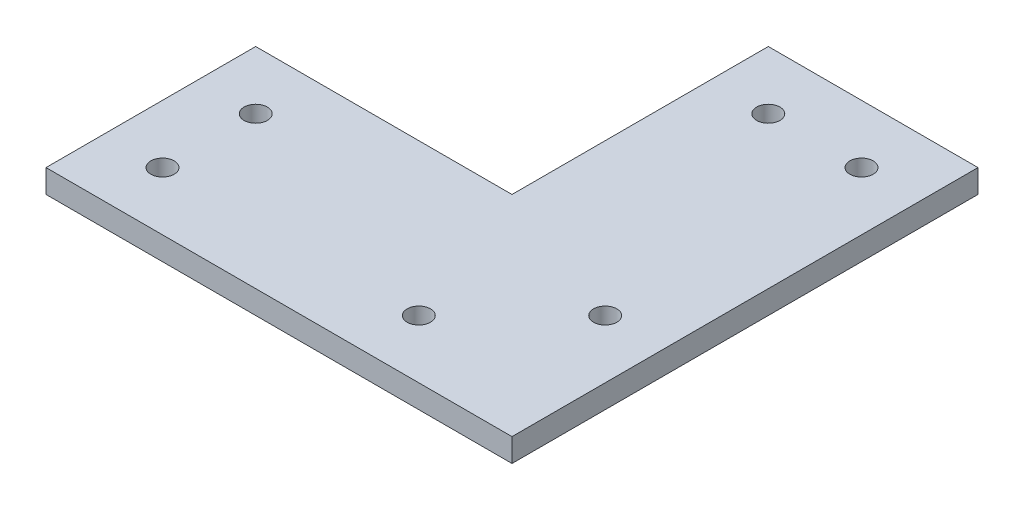
ISO-10303-21;
HEADER;
FILE_DESCRIPTION(('STEP AP214'),'2;1');
FILE_NAME('part.step','',(''),(''),'','','');
FILE_SCHEMA(('AUTOMOTIVE_DESIGN { 1 0 10303 214 1 1 1 1 }'));
ENDSEC;
DATA;
#1=APPLICATION_CONTEXT('core data for automotive mechanical design processes');
#2=APPLICATION_PROTOCOL_DEFINITION('international standard','automotive_design',2000,#1);
#3=PRODUCT_CONTEXT('',#1,'mechanical');
#4=PRODUCT('Part','Part','',(#3));
#5=PRODUCT_RELATED_PRODUCT_CATEGORY('part','',(#4));
#6=PRODUCT_DEFINITION_FORMATION('','',#4);
#7=PRODUCT_DEFINITION_CONTEXT('part definition',#1,'design');
#8=PRODUCT_DEFINITION('design','',#6,#7);
#9=PRODUCT_DEFINITION_SHAPE('','',#8);
#10=(LENGTH_UNIT() NAMED_UNIT(*) SI_UNIT(.MILLI.,.METRE.));
#11=(NAMED_UNIT(*) PLANE_ANGLE_UNIT() SI_UNIT($,.RADIAN.));
#12=(NAMED_UNIT(*) SI_UNIT($,.STERADIAN.) SOLID_ANGLE_UNIT());
#13=UNCERTAINTY_MEASURE_WITH_UNIT(LENGTH_MEASURE(1.E-05),#10,'distance_accuracy_value','');
#14=(GEOMETRIC_REPRESENTATION_CONTEXT(3) GLOBAL_UNCERTAINTY_ASSIGNED_CONTEXT((#13)) GLOBAL_UNIT_ASSIGNED_CONTEXT((#10,
#11,#12)) REPRESENTATION_CONTEXT('',''));
#15=CARTESIAN_POINT('',(0.,0.,0.));
#16=DIRECTION('',(0.,0.,1.));
#17=DIRECTION('',(1.,0.,0.));
#18=AXIS2_PLACEMENT_3D('',#15,#16,#17);
#19=CARTESIAN_POINT('',(0.,3.175,0.));
#20=DIRECTION('',(0.,1.,0.));
#21=DIRECTION('',(0.,0.,1.));
#22=AXIS2_PLACEMENT_3D('',#19,#20,#21);
#23=PLANE('',#22);
#24=CARTESIAN_POINT('',(55.5625,3.175,-55.5625));
#25=DIRECTION('',(0.,1.,0.));
#26=DIRECTION('',(0.,0.,1.));
#27=AXIS2_PLACEMENT_3D('',#24,#25,#26);
#28=CIRCLE('',#27,1.5875);
#29=CARTESIAN_POINT('',(55.5625,3.175,-53.975));
#30=VERTEX_POINT('',#29);
#31=EDGE_CURVE('E200',#30,#30,#28,.T.);
#32=ORIENTED_EDGE('',*,*,#31,.F.);
#33=EDGE_LOOP('',(#32));
#34=FACE_BOUND('',#33,.T.);
#35=CARTESIAN_POINT('',(42.8625,3.175,-7.93750000000001));
#36=DIRECTION('',(0.,1.,0.));
#37=DIRECTION('',(0.,0.,1.));
#38=AXIS2_PLACEMENT_3D('',#35,#36,#37);
#39=CIRCLE('',#38,1.5875);
#40=CARTESIAN_POINT('',(42.8625,3.175,-6.35000000000002));
#41=VERTEX_POINT('',#40);
#42=EDGE_CURVE('E212',#41,#41,#39,.T.);
#43=ORIENTED_EDGE('',*,*,#42,.F.);
#44=EDGE_LOOP('',(#43));
#45=FACE_BOUND('',#44,.T.);
#46=CARTESIAN_POINT('',(7.93749999999999,3.175,-20.6375));
#47=DIRECTION('',(0.,1.,0.));
#48=DIRECTION('',(0.,0.,1.));
#49=AXIS2_PLACEMENT_3D('',#46,#47,#48);
#50=CIRCLE('',#49,1.5875);
#51=CARTESIAN_POINT('',(7.93749999999999,3.175,-19.05));
#52=VERTEX_POINT('',#51);
#53=EDGE_CURVE('E125',#52,#52,#50,.T.);
#54=ORIENTED_EDGE('',*,*,#53,.F.);
#55=EDGE_LOOP('',(#54));
#56=FACE_BOUND('',#55,.T.);
#57=DIRECTION('',(1.,0.,0.));
#58=VECTOR('',#57,1.);
#59=CARTESIAN_POINT('',(0.,3.175,0.));
#60=LINE('',#59,#58);
#61=CARTESIAN_POINT('',(0.,3.175,0.));
#62=VERTEX_POINT('',#61);
#63=CARTESIAN_POINT('',(63.5,3.175,0.));
#64=VERTEX_POINT('',#63);
#65=EDGE_CURVE('E132',#62,#64,#60,.T.);
#66=ORIENTED_EDGE('',*,*,#65,.T.);
#67=DIRECTION('',(0.,0.,-1.));
#68=VECTOR('',#67,1.);
#69=CARTESIAN_POINT('',(63.5,3.175,0.));
#70=LINE('',#69,#68);
#71=CARTESIAN_POINT('',(63.5,3.175,-63.5));
#72=VERTEX_POINT('',#71);
#73=EDGE_CURVE('E90',#64,#72,#70,.T.);
#74=ORIENTED_EDGE('',*,*,#73,.T.);
#75=DIRECTION('',(-1.,0.,0.));
#76=VECTOR('',#75,1.);
#77=CARTESIAN_POINT('',(34.925,3.175,-63.5));
#78=LINE('',#77,#76);
#79=CARTESIAN_POINT('',(34.925,3.175,-63.5));
#80=VERTEX_POINT('',#79);
#81=EDGE_CURVE('E103',#72,#80,#78,.T.);
#82=ORIENTED_EDGE('',*,*,#81,.T.);
#83=DIRECTION('',(0.,0.,1.));
#84=VECTOR('',#83,1.);
#85=CARTESIAN_POINT('',(34.925,3.175,-28.575));
#86=LINE('',#85,#84);
#87=CARTESIAN_POINT('',(34.925,3.175,-28.575));
#88=VERTEX_POINT('',#87);
#89=EDGE_CURVE('E97',#80,#88,#86,.T.);
#90=ORIENTED_EDGE('',*,*,#89,.T.);
#91=DIRECTION('',(-1.,0.,0.));
#92=VECTOR('',#91,1.);
#93=CARTESIAN_POINT('',(0.,3.175,-28.575));
#94=LINE('',#93,#92);
#95=CARTESIAN_POINT('',(0.,3.175,-28.575));
#96=VERTEX_POINT('',#95);
#97=EDGE_CURVE('E101',#88,#96,#94,.T.);
#98=ORIENTED_EDGE('',*,*,#97,.T.);
#99=DIRECTION('',(0.,0.,1.));
#100=VECTOR('',#99,1.);
#101=CARTESIAN_POINT('',(0.,3.175,0.));
#102=LINE('',#101,#100);
#103=EDGE_CURVE('E53',#96,#62,#102,.T.);
#104=ORIENTED_EDGE('',*,*,#103,.T.);
#105=EDGE_LOOP('',(#66,#74,#82,#90,#98,#104));
#106=FACE_BOUND('',#105,.T.);
#107=CARTESIAN_POINT('',(7.93749999999999,3.175,-7.93750000000001));
#108=DIRECTION('',(0.,1.,0.));
#109=DIRECTION('',(0.,0.,1.));
#110=AXIS2_PLACEMENT_3D('',#107,#108,#109);
#111=CIRCLE('',#110,1.5875);
#112=CARTESIAN_POINT('',(7.93749999999999,3.175,-6.35000000000001));
#113=VERTEX_POINT('',#112);
#114=EDGE_CURVE('E218',#113,#113,#111,.T.);
#115=ORIENTED_EDGE('',*,*,#114,.F.);
#116=EDGE_LOOP('',(#115));
#117=FACE_BOUND('',#116,.T.);
#118=CARTESIAN_POINT('',(55.5625,3.175,-20.6375));
#119=DIRECTION('',(0.,1.,0.));
#120=DIRECTION('',(0.,0.,1.));
#121=AXIS2_PLACEMENT_3D('',#118,#119,#120);
#122=CIRCLE('',#121,1.5875);
#123=CARTESIAN_POINT('',(55.5625,3.175,-19.05));
#124=VERTEX_POINT('',#123);
#125=EDGE_CURVE('E206',#124,#124,#122,.T.);
#126=ORIENTED_EDGE('',*,*,#125,.F.);
#127=EDGE_LOOP('',(#126));
#128=FACE_BOUND('',#127,.T.);
#129=CARTESIAN_POINT('',(42.8625,3.175,-55.5625));
#130=DIRECTION('',(0.,1.,0.));
#131=DIRECTION('',(0.,0.,1.));
#132=AXIS2_PLACEMENT_3D('',#129,#130,#131);
#133=CIRCLE('',#132,1.5875);
#134=CARTESIAN_POINT('',(42.8625,3.175,-53.975));
#135=VERTEX_POINT('',#134);
#136=EDGE_CURVE('E191',#135,#135,#133,.T.);
#137=ORIENTED_EDGE('',*,*,#136,.F.);
#138=EDGE_LOOP('',(#137));
#139=FACE_BOUND('',#138,.T.);
#140=ADVANCED_FACE('F36',(#34,#45,#56,#106,#117,#128,#139),#23,.T.);
#141=CARTESIAN_POINT('',(0.,0.,0.));
#142=DIRECTION('',(0.,1.,0.));
#143=DIRECTION('',(0.,0.,1.));
#144=AXIS2_PLACEMENT_3D('',#141,#142,#143);
#145=PLANE('',#144);
#146=DIRECTION('',(1.,0.,0.));
#147=VECTOR('',#146,1.);
#148=CARTESIAN_POINT('',(0.,0.,0.));
#149=LINE('',#148,#147);
#150=CARTESIAN_POINT('',(0.,0.,0.));
#151=VERTEX_POINT('',#150);
#152=CARTESIAN_POINT('',(63.5,0.,0.));
#153=VERTEX_POINT('',#152);
#154=EDGE_CURVE('E121',#151,#153,#149,.T.);
#155=ORIENTED_EDGE('',*,*,#154,.F.);
#156=DIRECTION('',(0.,0.,1.));
#157=VECTOR('',#156,1.);
#158=CARTESIAN_POINT('',(0.,0.,0.));
#159=LINE('',#158,#157);
#160=CARTESIAN_POINT('',(0.,0.,-28.575));
#161=VERTEX_POINT('',#160);
#162=EDGE_CURVE('E82',#161,#151,#159,.T.);
#163=ORIENTED_EDGE('',*,*,#162,.F.);
#164=DIRECTION('',(-1.,0.,0.));
#165=VECTOR('',#164,1.);
#166=CARTESIAN_POINT('',(0.,0.,-28.575));
#167=LINE('',#166,#165);
#168=CARTESIAN_POINT('',(34.925,0.,-28.575));
#169=VERTEX_POINT('',#168);
#170=EDGE_CURVE('E76',#169,#161,#167,.T.);
#171=ORIENTED_EDGE('',*,*,#170,.F.);
#172=DIRECTION('',(0.,0.,1.));
#173=VECTOR('',#172,1.);
#174=CARTESIAN_POINT('',(34.925,0.,-28.575));
#175=LINE('',#174,#173);
#176=CARTESIAN_POINT('',(34.925,0.,-63.5));
#177=VERTEX_POINT('',#176);
#178=EDGE_CURVE('E111',#177,#169,#175,.T.);
#179=ORIENTED_EDGE('',*,*,#178,.F.);
#180=DIRECTION('',(-1.,0.,0.));
#181=VECTOR('',#180,1.);
#182=CARTESIAN_POINT('',(34.925,0.,-63.5));
#183=LINE('',#182,#181);
#184=CARTESIAN_POINT('',(63.5,0.,-63.5));
#185=VERTEX_POINT('',#184);
#186=EDGE_CURVE('E127',#185,#177,#183,.T.);
#187=ORIENTED_EDGE('',*,*,#186,.F.);
#188=DIRECTION('',(0.,0.,-1.));
#189=VECTOR('',#188,1.);
#190=CARTESIAN_POINT('',(63.5,0.,0.));
#191=LINE('',#190,#189);
#192=EDGE_CURVE('E124',#153,#185,#191,.T.);
#193=ORIENTED_EDGE('',*,*,#192,.F.);
#194=EDGE_LOOP('',(#155,#163,#171,#179,#187,#193));
#195=FACE_BOUND('',#194,.T.);
#196=CARTESIAN_POINT('',(7.93749999999999,0.,-20.6375));
#197=DIRECTION('',(0.,1.,0.));
#198=DIRECTION('',(0.,0.,1.));
#199=AXIS2_PLACEMENT_3D('',#196,#197,#198);
#200=CIRCLE('',#199,1.5875);
#201=CARTESIAN_POINT('',(7.93749999999999,0.,-19.05));
#202=VERTEX_POINT('',#201);
#203=EDGE_CURVE('E221',#202,#202,#200,.T.);
#204=ORIENTED_EDGE('',*,*,#203,.T.);
#205=EDGE_LOOP('',(#204));
#206=FACE_BOUND('',#205,.T.);
#207=CARTESIAN_POINT('',(7.93749999999999,0.,-7.93750000000001));
#208=DIRECTION('',(0.,1.,0.));
#209=DIRECTION('',(0.,0.,1.));
#210=AXIS2_PLACEMENT_3D('',#207,#208,#209);
#211=CIRCLE('',#210,1.5875);
#212=CARTESIAN_POINT('',(7.93749999999999,0.,-6.35000000000001));
#213=VERTEX_POINT('',#212);
#214=EDGE_CURVE('E215',#213,#213,#211,.T.);
#215=ORIENTED_EDGE('',*,*,#214,.T.);
#216=EDGE_LOOP('',(#215));
#217=FACE_BOUND('',#216,.T.);
#218=CARTESIAN_POINT('',(42.8625,0.,-7.93750000000001));
#219=DIRECTION('',(0.,1.,0.));
#220=DIRECTION('',(0.,0.,1.));
#221=AXIS2_PLACEMENT_3D('',#218,#219,#220);
#222=CIRCLE('',#221,1.5875);
#223=CARTESIAN_POINT('',(42.8625,0.,-6.35000000000002));
#224=VERTEX_POINT('',#223);
#225=EDGE_CURVE('E209',#224,#224,#222,.T.);
#226=ORIENTED_EDGE('',*,*,#225,.T.);
#227=EDGE_LOOP('',(#226));
#228=FACE_BOUND('',#227,.T.);
#229=CARTESIAN_POINT('',(55.5625,0.,-20.6375));
#230=DIRECTION('',(0.,1.,0.));
#231=DIRECTION('',(0.,0.,1.));
#232=AXIS2_PLACEMENT_3D('',#229,#230,#231);
#233=CIRCLE('',#232,1.5875);
#234=CARTESIAN_POINT('',(55.5625,0.,-19.05));
#235=VERTEX_POINT('',#234);
#236=EDGE_CURVE('E203',#235,#235,#233,.T.);
#237=ORIENTED_EDGE('',*,*,#236,.T.);
#238=EDGE_LOOP('',(#237));
#239=FACE_BOUND('',#238,.T.);
#240=CARTESIAN_POINT('',(55.5625,0.,-55.5625));
#241=DIRECTION('',(0.,1.,0.));
#242=DIRECTION('',(0.,0.,1.));
#243=AXIS2_PLACEMENT_3D('',#240,#241,#242);
#244=CIRCLE('',#243,1.5875);
#245=CARTESIAN_POINT('',(55.5625,0.,-53.975));
#246=VERTEX_POINT('',#245);
#247=EDGE_CURVE('E197',#246,#246,#244,.T.);
#248=ORIENTED_EDGE('',*,*,#247,.T.);
#249=EDGE_LOOP('',(#248));
#250=FACE_BOUND('',#249,.T.);
#251=CARTESIAN_POINT('',(42.8625,0.,-55.5625));
#252=DIRECTION('',(0.,1.,0.));
#253=DIRECTION('',(0.,0.,1.));
#254=AXIS2_PLACEMENT_3D('',#251,#252,#253);
#255=CIRCLE('',#254,1.5875);
#256=CARTESIAN_POINT('',(42.8625,0.,-53.975));
#257=VERTEX_POINT('',#256);
#258=EDGE_CURVE('E194',#257,#257,#255,.T.);
#259=ORIENTED_EDGE('',*,*,#258,.T.);
#260=EDGE_LOOP('',(#259));
#261=FACE_BOUND('',#260,.T.);
#262=ADVANCED_FACE('F141',(#195,#206,#217,#228,#239,#250,#261),#145,.F.);
#263=CARTESIAN_POINT('',(0.,3.175,0.));
#264=DIRECTION('',(0.,0.,-1.));
#265=DIRECTION('',(-1.,0.,0.));
#266=AXIS2_PLACEMENT_3D('',#263,#264,#265);
#267=PLANE('',#266);
#268=ORIENTED_EDGE('',*,*,#154,.T.);
#269=DIRECTION('',(0.,-1.,0.));
#270=VECTOR('',#269,1.);
#271=CARTESIAN_POINT('',(63.5,3.175,0.));
#272=LINE('',#271,#270);
#273=EDGE_CURVE('E11',#64,#153,#272,.T.);
#274=ORIENTED_EDGE('',*,*,#273,.F.);
#275=ORIENTED_EDGE('',*,*,#65,.F.);
#276=DIRECTION('',(0.,-1.,0.));
#277=VECTOR('',#276,1.);
#278=CARTESIAN_POINT('',(0.,3.175,0.));
#279=LINE('',#278,#277);
#280=EDGE_CURVE('E117',#62,#151,#279,.T.);
#281=ORIENTED_EDGE('',*,*,#280,.T.);
#282=EDGE_LOOP('',(#268,#274,#275,#281));
#283=FACE_BOUND('',#282,.T.);
#284=ADVANCED_FACE('F38',(#283),#267,.F.);
#285=CARTESIAN_POINT('',(63.5,3.175,0.));
#286=DIRECTION('',(-1.,0.,0.));
#287=DIRECTION('',(0.,0.,1.));
#288=AXIS2_PLACEMENT_3D('',#285,#286,#287);
#289=PLANE('',#288);
#290=ORIENTED_EDGE('',*,*,#192,.T.);
#291=DIRECTION('',(0.,-1.,0.));
#292=VECTOR('',#291,1.);
#293=CARTESIAN_POINT('',(63.5,3.175,-63.5));
#294=LINE('',#293,#292);
#295=EDGE_CURVE('E45',#72,#185,#294,.T.);
#296=ORIENTED_EDGE('',*,*,#295,.F.);
#297=ORIENTED_EDGE('',*,*,#73,.F.);
#298=ORIENTED_EDGE('',*,*,#273,.T.);
#299=EDGE_LOOP('',(#290,#296,#297,#298));
#300=FACE_BOUND('',#299,.T.);
#301=ADVANCED_FACE('F301',(#300),#289,.F.);
#302=CARTESIAN_POINT('',(34.925,3.175,-63.5));
#303=DIRECTION('',(0.,0.,1.));
#304=DIRECTION('',(1.,0.,0.));
#305=AXIS2_PLACEMENT_3D('',#302,#303,#304);
#306=PLANE('',#305);
#307=ORIENTED_EDGE('',*,*,#186,.T.);
#308=DIRECTION('',(0.,-1.,0.));
#309=VECTOR('',#308,1.);
#310=CARTESIAN_POINT('',(34.925,3.175,-63.5));
#311=LINE('',#310,#309);
#312=EDGE_CURVE('E112',#80,#177,#311,.T.);
#313=ORIENTED_EDGE('',*,*,#312,.F.);
#314=ORIENTED_EDGE('',*,*,#81,.F.);
#315=ORIENTED_EDGE('',*,*,#295,.T.);
#316=EDGE_LOOP('',(#307,#313,#314,#315));
#317=FACE_BOUND('',#316,.T.);
#318=ADVANCED_FACE('F138',(#317),#306,.F.);
#319=CARTESIAN_POINT('',(34.925,3.175,-28.575));
#320=DIRECTION('',(1.,0.,0.));
#321=DIRECTION('',(0.,0.,-1.));
#322=AXIS2_PLACEMENT_3D('',#319,#320,#321);
#323=PLANE('',#322);
#324=ORIENTED_EDGE('',*,*,#178,.T.);
#325=DIRECTION('',(0.,-1.,0.));
#326=VECTOR('',#325,1.);
#327=CARTESIAN_POINT('',(34.925,3.175,-28.575));
#328=LINE('',#327,#326);
#329=EDGE_CURVE('E108',#88,#169,#328,.T.);
#330=ORIENTED_EDGE('',*,*,#329,.F.);
#331=ORIENTED_EDGE('',*,*,#89,.F.);
#332=ORIENTED_EDGE('',*,*,#312,.T.);
#333=EDGE_LOOP('',(#324,#330,#331,#332));
#334=FACE_BOUND('',#333,.T.);
#335=ADVANCED_FACE('F109',(#334),#323,.F.);
#336=CARTESIAN_POINT('',(0.,3.175,-28.575));
#337=DIRECTION('',(0.,0.,1.));
#338=DIRECTION('',(1.,0.,0.));
#339=AXIS2_PLACEMENT_3D('',#336,#337,#338);
#340=PLANE('',#339);
#341=ORIENTED_EDGE('',*,*,#170,.T.);
#342=DIRECTION('',(0.,-1.,0.));
#343=VECTOR('',#342,1.);
#344=CARTESIAN_POINT('',(0.,3.175,-28.575));
#345=LINE('',#344,#343);
#346=EDGE_CURVE('E113',#96,#161,#345,.T.);
#347=ORIENTED_EDGE('',*,*,#346,.F.);
#348=ORIENTED_EDGE('',*,*,#97,.F.);
#349=ORIENTED_EDGE('',*,*,#329,.T.);
#350=EDGE_LOOP('',(#341,#347,#348,#349));
#351=FACE_BOUND('',#350,.T.);
#352=ADVANCED_FACE('F115',(#351),#340,.F.);
#353=CARTESIAN_POINT('',(0.,3.175,0.));
#354=DIRECTION('',(1.,0.,0.));
#355=DIRECTION('',(0.,0.,-1.));
#356=AXIS2_PLACEMENT_3D('',#353,#354,#355);
#357=PLANE('',#356);
#358=ORIENTED_EDGE('',*,*,#162,.T.);
#359=ORIENTED_EDGE('',*,*,#280,.F.);
#360=ORIENTED_EDGE('',*,*,#103,.F.);
#361=ORIENTED_EDGE('',*,*,#346,.T.);
#362=EDGE_LOOP('',(#358,#359,#360,#361));
#363=FACE_BOUND('',#362,.T.);
#364=ADVANCED_FACE('F146',(#363),#357,.F.);
#365=CARTESIAN_POINT('',(7.93749999999999,3.175,-20.6375));
#366=DIRECTION('',(0.,-1.,0.));
#367=DIRECTION('',(0.,0.,-1.));
#368=AXIS2_PLACEMENT_3D('',#365,#366,#367);
#369=CYLINDRICAL_SURFACE('',#368,1.5875);
#370=ORIENTED_EDGE('',*,*,#53,.T.);
#371=EDGE_LOOP('',(#370));
#372=FACE_BOUND('',#371,.T.);
#373=ORIENTED_EDGE('',*,*,#203,.F.);
#374=EDGE_LOOP('',(#373));
#375=FACE_BOUND('',#374,.T.);
#376=ADVANCED_FACE('F148',(#372,#375),#369,.F.);
#377=CARTESIAN_POINT('',(7.93749999999999,3.175,-7.93750000000001));
#378=DIRECTION('',(0.,-1.,0.));
#379=DIRECTION('',(0.,0.,-1.));
#380=AXIS2_PLACEMENT_3D('',#377,#378,#379);
#381=CYLINDRICAL_SURFACE('',#380,1.5875);
#382=ORIENTED_EDGE('',*,*,#114,.T.);
#383=EDGE_LOOP('',(#382));
#384=FACE_BOUND('',#383,.T.);
#385=ORIENTED_EDGE('',*,*,#214,.F.);
#386=EDGE_LOOP('',(#385));
#387=FACE_BOUND('',#386,.T.);
#388=ADVANCED_FACE('F154',(#384,#387),#381,.F.);
#389=CARTESIAN_POINT('',(42.8625,3.175,-7.93750000000001));
#390=DIRECTION('',(0.,-1.,0.));
#391=DIRECTION('',(0.,0.,-1.));
#392=AXIS2_PLACEMENT_3D('',#389,#390,#391);
#393=CYLINDRICAL_SURFACE('',#392,1.5875);
#394=ORIENTED_EDGE('',*,*,#42,.T.);
#395=EDGE_LOOP('',(#394));
#396=FACE_BOUND('',#395,.T.);
#397=ORIENTED_EDGE('',*,*,#225,.F.);
#398=EDGE_LOOP('',(#397));
#399=FACE_BOUND('',#398,.T.);
#400=ADVANCED_FACE('F170',(#396,#399),#393,.F.);
#401=CARTESIAN_POINT('',(55.5625,3.175,-20.6375));
#402=DIRECTION('',(0.,-1.,0.));
#403=DIRECTION('',(0.,0.,-1.));
#404=AXIS2_PLACEMENT_3D('',#401,#402,#403);
#405=CYLINDRICAL_SURFACE('',#404,1.5875);
#406=ORIENTED_EDGE('',*,*,#125,.T.);
#407=EDGE_LOOP('',(#406));
#408=FACE_BOUND('',#407,.T.);
#409=ORIENTED_EDGE('',*,*,#236,.F.);
#410=EDGE_LOOP('',(#409));
#411=FACE_BOUND('',#410,.T.);
#412=ADVANCED_FACE('F174',(#408,#411),#405,.F.);
#413=CARTESIAN_POINT('',(55.5625,3.175,-55.5625));
#414=DIRECTION('',(0.,-1.,0.));
#415=DIRECTION('',(0.,0.,-1.));
#416=AXIS2_PLACEMENT_3D('',#413,#414,#415);
#417=CYLINDRICAL_SURFACE('',#416,1.5875);
#418=ORIENTED_EDGE('',*,*,#31,.T.);
#419=EDGE_LOOP('',(#418));
#420=FACE_BOUND('',#419,.T.);
#421=ORIENTED_EDGE('',*,*,#247,.F.);
#422=EDGE_LOOP('',(#421));
#423=FACE_BOUND('',#422,.T.);
#424=ADVANCED_FACE('F178',(#420,#423),#417,.F.);
#425=CARTESIAN_POINT('',(42.8625,3.175,-55.5625));
#426=DIRECTION('',(0.,-1.,0.));
#427=DIRECTION('',(0.,0.,-1.));
#428=AXIS2_PLACEMENT_3D('',#425,#426,#427);
#429=CYLINDRICAL_SURFACE('',#428,1.5875);
#430=ORIENTED_EDGE('',*,*,#136,.T.);
#431=EDGE_LOOP('',(#430));
#432=FACE_BOUND('',#431,.T.);
#433=ORIENTED_EDGE('',*,*,#258,.F.);
#434=EDGE_LOOP('',(#433));
#435=FACE_BOUND('',#434,.T.);
#436=ADVANCED_FACE('F182',(#432,#435),#429,.F.);
#437=CLOSED_SHELL('',(#140,#262,#284,#301,#318,#335,#352,#364,#376,#388,#400,#412,#424,#436));
#438=MANIFOLD_SOLID_BREP('B2',#437);
#439=ADVANCED_BREP_SHAPE_REPRESENTATION('',(#18,#438),#14);
#440=SHAPE_DEFINITION_REPRESENTATION(#9,#439);
ENDSEC;
END-ISO-10303-21;
